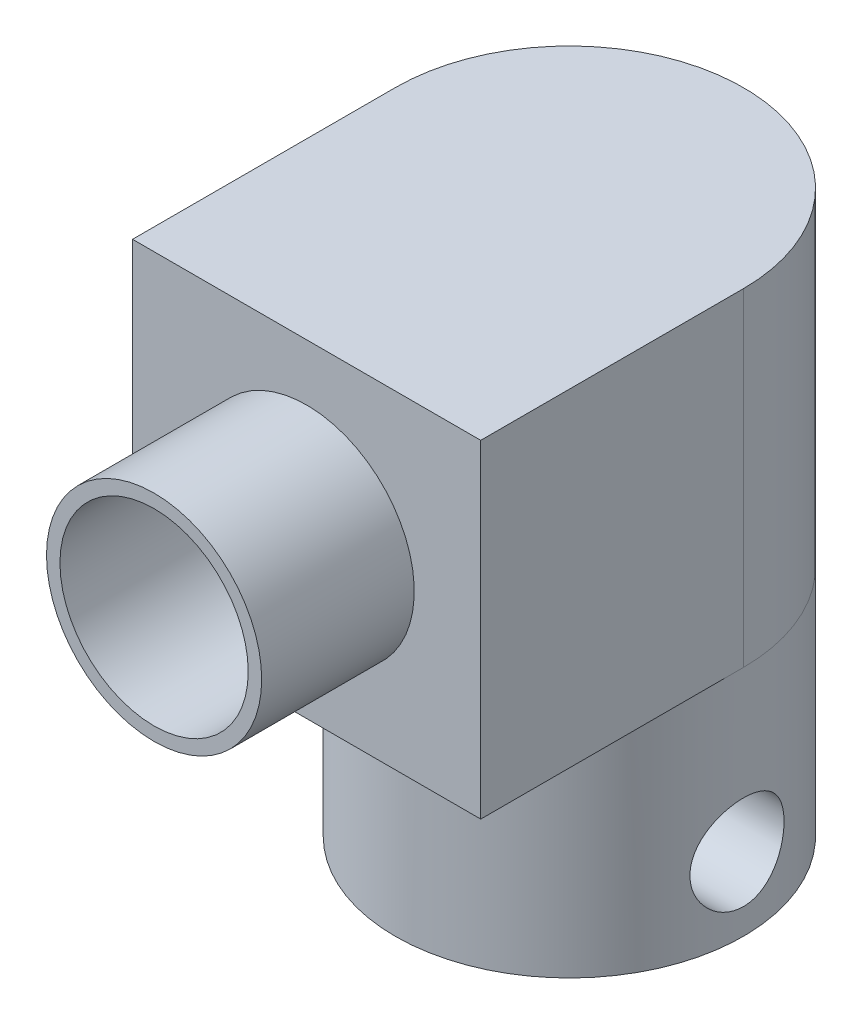
ISO-10303-21;
HEADER;
FILE_DESCRIPTION(('STEP AP214'),'2;1');
FILE_NAME('part.step','',(''),(''),'','','');
FILE_SCHEMA(('AUTOMOTIVE_DESIGN { 1 0 10303 214 1 1 1 1 }'));
ENDSEC;
DATA;
#1=APPLICATION_CONTEXT('core data for automotive mechanical design processes');
#2=APPLICATION_PROTOCOL_DEFINITION('international standard','automotive_design',2000,#1);
#3=PRODUCT_CONTEXT('',#1,'mechanical');
#4=PRODUCT('Part','Part','',(#3));
#5=PRODUCT_RELATED_PRODUCT_CATEGORY('part','',(#4));
#6=PRODUCT_DEFINITION_FORMATION('','',#4);
#7=PRODUCT_DEFINITION_CONTEXT('part definition',#1,'design');
#8=PRODUCT_DEFINITION('design','',#6,#7);
#9=PRODUCT_DEFINITION_SHAPE('','',#8);
#10=(LENGTH_UNIT() NAMED_UNIT(*) SI_UNIT(.MILLI.,.METRE.));
#11=(NAMED_UNIT(*) PLANE_ANGLE_UNIT() SI_UNIT($,.RADIAN.));
#12=(NAMED_UNIT(*) SI_UNIT($,.STERADIAN.) SOLID_ANGLE_UNIT());
#13=UNCERTAINTY_MEASURE_WITH_UNIT(LENGTH_MEASURE(1.E-05),#10,'distance_accuracy_value','');
#14=(GEOMETRIC_REPRESENTATION_CONTEXT(3) GLOBAL_UNCERTAINTY_ASSIGNED_CONTEXT((#13)) GLOBAL_UNIT_ASSIGNED_CONTEXT((#10,
#11,#12)) REPRESENTATION_CONTEXT('',''));
#15=CARTESIAN_POINT('',(0.,0.,0.));
#16=DIRECTION('',(0.,0.,1.));
#17=DIRECTION('',(1.,0.,0.));
#18=AXIS2_PLACEMENT_3D('',#15,#16,#17);
#19=CARTESIAN_POINT('',(0.,27.4955,0.));
#20=DIRECTION('',(0.,-1.,0.));
#21=DIRECTION('',(0.,0.,-1.));
#22=AXIS2_PLACEMENT_3D('',#19,#20,#21);
#23=CYLINDRICAL_SURFACE('',#22,20.55);
#24=CARTESIAN_POINT('',(-20.55,3.04375,0.));
#25=CARTESIAN_POINT('',(-20.5499955456177,3.04375693431693,-0.306142805772744));
#26=CARTESIAN_POINT('',(-20.5430917498544,3.06913690307284,-0.612359281224114));
#27=CARTESIAN_POINT('',(-20.5162220063125,3.16980008715458,-1.21596071790738));
#28=CARTESIAN_POINT('',(-20.4962500289559,3.24510633837057,-1.51334153617645));
#29=CARTESIAN_POINT('',(-20.4454466222146,3.44298702795202,-2.0904724597968));
#30=CARTESIAN_POINT('',(-20.4146294171469,3.56549957165747,-2.37024509569505));
#31=CARTESIAN_POINT('',(-20.3453866191758,3.85408307952741,-2.90527314793898));
#32=CARTESIAN_POINT('',(-20.3069604631205,4.02015726806116,-3.16052674750989));
#33=CARTESIAN_POINT('',(-20.225621469461,4.39531848990894,-3.64534071841445));
#34=CARTESIAN_POINT('',(-20.1826302656136,4.60524929730204,-3.87423501687347));
#35=CARTESIAN_POINT('',(-20.097505842233,5.06036147203112,-4.29403500654341));
#36=CARTESIAN_POINT('',(-20.0553727371284,5.30554750601071,-4.48493566064534));
#37=CARTESIAN_POINT('',(-19.9759305504996,5.82956047415262,-4.82660396235491));
#38=CARTESIAN_POINT('',(-19.9387201915211,6.10890658096501,-4.97660042803178));
#39=CARTESIAN_POINT('',(-19.8744908595214,6.69002190073215,-5.22723344745557));
#40=CARTESIAN_POINT('',(-19.8474699488583,6.99178683740803,-5.32787938687294));
#41=CARTESIAN_POINT('',(-19.8074888143272,7.60178561046114,-5.47463170932488));
#42=CARTESIAN_POINT('',(-19.7942172548341,7.90970747137634,-5.52194795894865));
#43=CARTESIAN_POINT('',(-19.7823077026328,8.52938255380937,-5.5644704110659));
#44=CARTESIAN_POINT('',(-19.7836668924584,8.84113502611086,-5.55968664653769));
#45=CARTESIAN_POINT('',(-19.8005868990115,9.45013793461201,-5.49910428263689));
#46=CARTESIAN_POINT('',(-19.8157386716941,9.74754771142475,-5.44477496267418));
#47=CARTESIAN_POINT('',(-19.8578809510857,10.3288650260883,-5.28899911807753));
#48=CARTESIAN_POINT('',(-19.8848724275681,10.6127714557873,-5.18754873378391));
#49=CARTESIAN_POINT('',(-19.9480089488772,11.1628276619384,-4.939225746161));
#50=CARTESIAN_POINT('',(-19.9842560886036,11.4287345552684,-4.79184219176853));
#51=CARTESIAN_POINT('',(-20.0617655401964,11.9325562645572,-4.45619282649871));
#52=CARTESIAN_POINT('',(-20.1030288634258,12.1704654165182,-4.2679187652381));
#53=CARTESIAN_POINT('',(-20.187619405724,12.6199267130721,-3.84834301404818));
#54=CARTESIAN_POINT('',(-20.2309694061362,12.8303258137321,-3.61580896874028));
#55=CARTESIAN_POINT('',(-20.31360813913,13.2093814534354,-3.11822635050758));
#56=CARTESIAN_POINT('',(-20.3528967026098,13.3780362548226,-2.85317642475709));
#57=CARTESIAN_POINT('',(-20.4232388029467,13.6693433009626,-2.29626761444222));
#58=CARTESIAN_POINT('',(-20.4542539092409,13.7917819247223,-2.00429181671365));
#59=CARTESIAN_POINT('',(-20.5042769768324,13.9855007385593,-1.40286942616056));
#60=CARTESIAN_POINT('',(-20.5232876377727,14.0567924314047,-1.09342677846717));
#61=CARTESIAN_POINT('',(-20.5467495605021,14.1443717498598,-0.475690838742117));
#62=CARTESIAN_POINT('',(-20.5516155058374,14.1622264758924,-0.167635135179871));
#63=CARTESIAN_POINT('',(-20.5474345532138,14.1467596166778,0.44707072594799));
#64=CARTESIAN_POINT('',(-20.5383891367012,14.1134434807091,0.753721029689363));
#65=CARTESIAN_POINT('',(-20.5076700971395,13.9978643188844,1.35128414599486));
#66=CARTESIAN_POINT('',(-20.4862232641405,13.9164797821466,1.64237960607598));
#67=CARTESIAN_POINT('',(-20.4331384948629,13.7080980506069,2.20675448683617));
#68=CARTESIAN_POINT('',(-20.4014994387813,13.5810958436897,2.48003194591187));
#69=CARTESIAN_POINT('',(-20.3305733914616,13.2822068576371,3.00706869299628));
#70=CARTESIAN_POINT('',(-20.2911461290779,13.109473387106,3.26032845894672));
#71=CARTESIAN_POINT('',(-20.2091989702079,12.7250856273105,3.73481606359932));
#72=CARTESIAN_POINT('',(-20.1666784462028,12.5134234273328,3.95603737540058));
#73=CARTESIAN_POINT('',(-20.081804046298,12.0498663041769,4.36680455857517));
#74=CARTESIAN_POINT('',(-20.0394908978611,11.7969812091867,4.55524351584594));
#75=CARTESIAN_POINT('',(-19.961175136926,11.2622797889479,4.88703993718276));
#76=CARTESIAN_POINT('',(-19.9251722674625,10.9804646425215,5.03039923715806));
#77=CARTESIAN_POINT('',(-19.8639697807312,10.3972722442555,5.2668904267061));
#78=CARTESIAN_POINT('',(-19.8387085239865,10.0960183545459,5.36030970931087));
#79=CARTESIAN_POINT('',(-19.801849841402,9.48127503280378,5.49492554517411));
#80=CARTESIAN_POINT('',(-19.7902488038115,9.1677888576346,5.53613590264771));
#81=CARTESIAN_POINT('',(-19.7823317112056,8.54882897432261,5.5643538797296));
#82=CARTESIAN_POINT('',(-19.7855132349689,8.2434417149351,5.55314307569314));
#83=CARTESIAN_POINT('',(-19.805623103107,7.63908616440629,5.48098232967845));
#84=CARTESIAN_POINT('',(-19.8225510747265,7.34011769943553,5.42003373641365));
#85=CARTESIAN_POINT('',(-19.8679431943393,6.7593992433651,5.25117363053405));
#86=CARTESIAN_POINT('',(-19.8963120258814,6.47752860001443,5.14364961325222));
#87=CARTESIAN_POINT('',(-19.9613893851851,5.9356125154418,4.88499128574498));
#88=CARTESIAN_POINT('',(-19.9980992541463,5.67557059339449,4.73384996100479));
#89=CARTESIAN_POINT('',(-20.0771065461908,5.17621429694496,4.38689029147111));
#90=CARTESIAN_POINT('',(-20.119539190167,4.93776260515301,4.18986099449636));
#91=CARTESIAN_POINT('',(-20.2044670418046,4.49672808133383,3.75900819313024));
#92=CARTESIAN_POINT('',(-20.2469622622319,4.29415403841642,3.52517569931734));
#93=CARTESIAN_POINT('',(-20.3283545924845,3.92620159809001,3.0210972604422));
#94=CARTESIAN_POINT('',(-20.3671509996028,3.76174778098293,2.75015874228775));
#95=CARTESIAN_POINT('',(-20.4356628373764,3.48097984957658,2.18343866249));
#96=CARTESIAN_POINT('',(-20.4653839305848,3.36463570107,1.88767273943278));
#97=CARTESIAN_POINT('',(-20.5086824116325,3.19807241802424,1.32762368378215));
#98=CARTESIAN_POINT('',(-20.5240620531397,3.14033817559968,1.06569067632233));
#99=CARTESIAN_POINT('',(-20.5447222673251,3.06317593988418,0.535856839401154));
#100=CARTESIAN_POINT('',(-20.550003898773,3.0437439306225,0.267956638576209));
#101=CARTESIAN_POINT('',(-20.55,3.04375,0.));
#102=B_SPLINE_CURVE_WITH_KNOTS('',3,(#24,#25,#26,#27,#28,#29,#30,#31,#32,#33,#34,#35,#36,#37,
#38,#39,#40,#41,#42,#43,#44,#45,#46,#47,#48,#49,#50,#51,#52,#53,#54,#55,#56,#57,#58,#59,#60,#61,
#62,#63,#64,#65,#66,#67,#68,#69,#70,#71,#72,#73,#74,#75,#76,#77,#78,#79,#80,#81,#82,#83,#84,#85,
#86,#87,#88,#89,#90,#91,#92,#93,#94,#95,#96,#97,#98,#99,#100,#101),.UNSPECIFIED.,.T.,.F.,(4,2,2,
2,2,2,2,2,2,2,2,2,2,2,2,2,2,2,2,2,2,2,2,2,2,2,2,2,2,2,2,2,2,2,2,2,2,2,4),(0.,0.917445584889056,
1.83531477227169,2.75198456573384,3.6687222289101,4.60506159920432,5.54152502462187,
6.49458423038777,7.44746210936509,8.37825766721183,9.3088739835236,10.2127595967962,
11.1167192598869,12.0311166809247,12.945698769504,13.8909861592124,14.8363128910214,
15.7859571209259,16.7353877121186,17.6566881796655,18.5778905430458,19.4827565385181,
20.387721984066,21.3107822105116,22.2340302198415,23.1840996897835,24.134130462286,
25.0786335146744,26.0228867851292,26.9352866548291,27.8476617842842,28.7525877546645,
29.6576593359882,30.5900527016247,31.5226741648892,32.4759796393901,33.4286890765618,
34.2317829601677,35.0347926352863),.UNSPECIFIED.);
#103=CARTESIAN_POINT('',(-20.55,3.04375,0.));
#104=VERTEX_POINT('',#103);
#105=EDGE_CURVE('E147',#104,#104,#102,.T.);
#106=ORIENTED_EDGE('',*,*,#105,.T.);
#107=EDGE_LOOP('',(#106));
#108=FACE_BOUND('',#107,.T.);
#109=CARTESIAN_POINT('',(19.7846047708187,8.6,-5.55625));
#110=CARTESIAN_POINT('',(19.7846099111517,8.29408791419413,-5.55624295354956));
#111=CARTESIAN_POINT('',(19.7917774234277,7.98810194953752,-5.53089989961452));
#112=CARTESIAN_POINT('',(19.8195843145754,7.38497846933255,-5.43039661013299));
#113=CARTESIAN_POINT('',(19.8402302061305,7.08784530402357,-5.3552122912726));
#114=CARTESIAN_POINT('',(19.8924884369557,6.51123996073559,-5.15768785493998));
#115=CARTESIAN_POINT('',(19.9240850558071,6.23174314097737,-5.0354153075904));
#116=CARTESIAN_POINT('',(19.9946644283277,5.69718328391201,-4.74739817436022));
#117=CARTESIAN_POINT('',(20.0336478143843,5.44212234139769,-4.58164986601607));
#118=CARTESIAN_POINT('',(20.1157315238416,4.95711655139443,-4.20682860424944));
#119=CARTESIAN_POINT('',(20.1589064605905,4.72789300831878,-3.99683845225135));
#120=CARTESIAN_POINT('',(20.2438652612443,4.30745028959308,-3.54146621058755));
#121=CARTESIAN_POINT('',(20.2856489771128,4.11623514763083,-3.29608036927498));
#122=CARTESIAN_POINT('',(20.3639516325386,3.77421620221989,-2.77186700883269));
#123=CARTESIAN_POINT('',(20.4003723001507,3.62413143770808,-2.49255440334088));
#124=CARTESIAN_POINT('',(20.4629879883136,3.373326219249,-1.9115103105989));
#125=CARTESIAN_POINT('',(20.4891847831941,3.27259719894902,-1.60978272424654));
#126=CARTESIAN_POINT('',(20.5278734346323,3.12570281135179,-1.00000449152069));
#127=CARTESIAN_POINT('',(20.5406730979897,3.0783099951828,-0.692269408006934));
#128=CARTESIAN_POINT('',(20.5522023409067,3.03556948971917,-0.0729679321546421));
#129=CARTESIAN_POINT('',(20.5509343388363,3.04021285489445,0.238597792460219));
#130=CARTESIAN_POINT('',(20.5346958110324,3.10055280238229,0.848165693500861));
#131=CARTESIAN_POINT('',(20.5200813179014,3.15492292363009,1.14631011066351));
#132=CARTESIAN_POINT('',(20.4792133458587,3.31102755340359,1.72907457504629));
#133=CARTESIAN_POINT('',(20.4529591940996,3.41276480007183,2.01369383937207));
#134=CARTESIAN_POINT('',(20.3912375825066,3.6617195659057,2.56469004876672));
#135=CARTESIAN_POINT('',(20.3556794464865,3.80938755780164,2.83085288316265));
#136=CARTESIAN_POINT('',(20.2791749499582,4.14566527990044,3.33507026200387));
#137=CARTESIAN_POINT('',(20.2382275144784,4.33428318302812,3.57311918071209));
#138=CARTESIAN_POINT('',(20.153852480509,4.75413140943505,4.02226945508818));
#139=CARTESIAN_POINT('',(20.1103873906528,4.9865179856255,4.23228423208074));
#140=CARTESIAN_POINT('',(20.0270371570568,5.48365991115382,4.6106310513191));
#141=CARTESIAN_POINT('',(19.9871522445296,5.7484173484398,4.77896040269859));
#142=CARTESIAN_POINT('',(19.9153245638176,6.3051942959987,5.07001654278555));
#143=CARTESIAN_POINT('',(19.883435047145,6.59737966166185,5.19244012807638));
#144=CARTESIAN_POINT('',(19.8318664794739,7.19926439334426,5.38606754506408));
#145=CARTESIAN_POINT('',(19.8121843026605,7.50895925369671,5.45728448949225));
#146=CARTESIAN_POINT('',(19.787927019825,8.12689057895396,5.54458736251051));
#147=CARTESIAN_POINT('',(19.7829070201881,8.4348803656252,5.56229743863344));
#148=CARTESIAN_POINT('',(19.7873238569898,9.04942216435015,5.54656516408198));
#149=CARTESIAN_POINT('',(19.7967591056933,9.35597433059962,5.5131284312701));
#150=CARTESIAN_POINT('',(19.8285928261844,9.9526277673974,5.39748517125687));
#151=CARTESIAN_POINT('',(19.8507296470314,10.2429349959468,5.31626220272824));
#152=CARTESIAN_POINT('',(19.9052149869172,10.8058037456702,5.10846159971124));
#153=CARTESIAN_POINT('',(19.9375648668522,11.0783628960603,4.98187792057755));
#154=CARTESIAN_POINT('',(20.0097390709008,11.6047736218821,4.68367513184515));
#155=CARTESIAN_POINT('',(20.0497152752714,11.8580658697406,4.5111062695207));
#156=CARTESIAN_POINT('',(20.1322838903647,12.3326932611006,4.12700365323291));
#157=CARTESIAN_POINT('',(20.1748768061121,12.5540222079014,3.91546236175647));
#158=CARTESIAN_POINT('',(20.2594168099149,12.9652203176716,3.45189410124383));
#159=CARTESIAN_POINT('',(20.3013067843807,13.1539548172731,3.19884813357714));
#160=CARTESIAN_POINT('',(20.3784205589915,13.4862715017229,2.66372666754108));
#161=CARTESIAN_POINT('',(20.4136447139998,13.629856090453,2.38165271574795));
#162=CARTESIAN_POINT('',(20.4732309169378,13.8664663082298,1.79846779879701));
#163=CARTESIAN_POINT('',(20.4976742124607,13.9598713123838,1.497519458451));
#164=CARTESIAN_POINT('',(20.5333024918853,14.0945612163352,0.883436390131982));
#165=CARTESIAN_POINT('',(20.5444905026413,14.1358580152214,0.570304461165306));
#166=CARTESIAN_POINT('',(20.5522002636445,14.1643964846355,-0.0486695197422701));
#167=CARTESIAN_POINT('',(20.5491730265587,14.1533003821365,-0.354430384698936));
#168=CARTESIAN_POINT('',(20.5298169461267,14.0812396365465,-0.95956460260317));
#169=CARTESIAN_POINT('',(20.5134886273872,14.0202769602378,-1.2589382069922));
#170=CARTESIAN_POINT('',(20.46945895039,13.8511638806168,-1.84074098156406));
#171=CARTESIAN_POINT('',(20.4418409766328,13.7433590895854,-2.12327734090201));
#172=CARTESIAN_POINT('',(20.3781157916977,13.4839300149016,-2.6664125733757));
#173=CARTESIAN_POINT('',(20.3420073647127,13.3322994548188,-2.9270082974143));
#174=CARTESIAN_POINT('',(20.2639293925301,12.9847051723792,-3.42656942574024));
#175=CARTESIAN_POINT('',(20.2218268893977,12.7876454548188,-3.66475138677513));
#176=CARTESIAN_POINT('',(20.137031070218,12.3568540265207,-4.105228294939));
#177=CARTESIAN_POINT('',(20.0943376002296,12.1231125901681,-4.30751369423161));
#178=CARTESIAN_POINT('',(20.0120708053271,11.6191865815018,-4.67502641042557));
#179=CARTESIAN_POINT('',(19.9725907391434,11.3482929922853,-4.83930432617433));
#180=CARTESIAN_POINT('',(19.902553710437,10.7816970138126,-5.11975461205687));
#181=CARTESIAN_POINT('',(19.8719910712672,10.4860105622046,-5.23595760545752));
#182=CARTESIAN_POINT('',(19.8273669587936,9.92629804030538,-5.40223793610318));
#183=CARTESIAN_POINT('',(19.8114630639176,9.66463496457813,-5.45985451533049));
#184=CARTESIAN_POINT('',(19.7900803543849,9.13533296325045,-5.53686130732699));
#185=CARTESIAN_POINT('',(19.7846002726627,8.86769476795701,-5.55625616614382));
#186=CARTESIAN_POINT('',(19.7846047708187,8.6,-5.55625));
#187=B_SPLINE_CURVE_WITH_KNOTS('',3,(#109,#110,#111,#112,#113,#114,#115,#116,#117,#118,#119,
#120,#121,#122,#123,#124,#125,#126,#127,#128,#129,#130,#131,#132,#133,#134,#135,#136,#137,#138,
#139,#140,#141,#142,#143,#144,#145,#146,#147,#148,#149,#150,#151,#152,#153,#154,#155,#156,#157,
#158,#159,#160,#161,#162,#163,#164,#165,#166,#167,#168,#169,#170,#171,#172,#173,#174,#175,#176,
#177,#178,#179,#180,#181,#182,#183,#184,#185,#186),.UNSPECIFIED.,.T.,.F.,(4,2,2,2,2,2,2,2,2,2,2,
2,2,2,2,2,2,2,2,2,2,2,2,2,2,2,2,2,2,2,2,2,2,2,2,2,2,2,4),(0.,0.916751587120096,1.83394647207474,
2.74983008614831,3.6657921452413,4.60303741061557,5.54038208923997,6.49319683765418,
7.44584615363307,8.37609233002781,9.30617859043214,10.2121562525253,11.1181862928032,
12.0333985393267,12.9487936152688,13.8930569412016,14.8373812050854,15.7878371516066,
16.7380496235284,17.6591140357364,18.5800772873481,19.4827170745915,20.3854771899225,
21.3085617665974,22.2318250614194,23.1826142737027,24.1333528552758,25.0767985875286,
26.0200288416782,26.9335387785712,27.84701268755,28.7538582687614,29.6608337866748,
30.5925372550853,31.5244881695358,32.477673888078,33.430251498071,34.2325716777875,
35.0347943253231),.UNSPECIFIED.);
#188=CARTESIAN_POINT('',(19.7846047708187,8.6,-5.55625));
#189=VERTEX_POINT('',#188);
#190=EDGE_CURVE('E136',#189,#189,#187,.T.);
#191=ORIENTED_EDGE('',*,*,#190,.T.);
#192=EDGE_LOOP('',(#191));
#193=FACE_BOUND('',#192,.T.);
#194=CARTESIAN_POINT('',(0.,0.,0.));
#195=DIRECTION('',(0.,1.,0.));
#196=DIRECTION('',(0.,0.,1.));
#197=AXIS2_PLACEMENT_3D('',#194,#195,#196);
#198=CIRCLE('',#197,20.55);
#199=CARTESIAN_POINT('',(0.,0.,20.55));
#200=VERTEX_POINT('',#199);
#201=EDGE_CURVE('E132',#200,#200,#198,.T.);
#202=ORIENTED_EDGE('',*,*,#201,.T.);
#203=EDGE_LOOP('',(#202));
#204=FACE_BOUND('',#203,.T.);
#205=CARTESIAN_POINT('',(0.,27.4955,0.));
#206=DIRECTION('',(0.,1.,0.));
#207=DIRECTION('',(0.,0.,1.));
#208=AXIS2_PLACEMENT_3D('',#205,#206,#207);
#209=CIRCLE('',#208,20.55);
#210=CARTESIAN_POINT('',(-20.55,27.4955,0.));
#211=VERTEX_POINT('',#210);
#212=CARTESIAN_POINT('',(20.55,27.4955,0.));
#213=VERTEX_POINT('',#212);
#214=EDGE_CURVE('E133',#211,#213,#209,.T.);
#215=ORIENTED_EDGE('',*,*,#214,.F.);
#216=CARTESIAN_POINT('',(0.,27.4955,0.));
#217=DIRECTION('',(0.,-1.,0.));
#218=DIRECTION('',(0.,0.,-1.));
#219=AXIS2_PLACEMENT_3D('',#216,#217,#218);
#220=CIRCLE('',#219,20.55);
#221=EDGE_CURVE('E12',#211,#213,#220,.T.);
#222=ORIENTED_EDGE('',*,*,#221,.T.);
#223=EDGE_LOOP('',(#215,#222));
#224=FACE_BOUND('',#223,.T.);
#225=ADVANCED_FACE('F42',(#108,#193,#204,#224),#23,.T.);
#226=ORIENTED_EDGE('',*,*,#221,.F.);
#227=DIRECTION('',(0.,-1.,0.));
#228=VECTOR('',#227,1.);
#229=CARTESIAN_POINT('',(-20.55,66.2178,0.));
#230=LINE('',#229,#228);
#231=CARTESIAN_POINT('',(-20.55,66.2178,0.));
#232=VERTEX_POINT('',#231);
#233=EDGE_CURVE('E104',#232,#211,#230,.T.);
#234=ORIENTED_EDGE('',*,*,#233,.F.);
#235=CARTESIAN_POINT('',(0.,66.2178,0.));
#236=DIRECTION('',(0.,1.,0.));
#237=DIRECTION('',(0.,0.,1.));
#238=AXIS2_PLACEMENT_3D('',#235,#236,#237);
#239=CIRCLE('',#238,20.55);
#240=CARTESIAN_POINT('',(20.55,66.2178,0.));
#241=VERTEX_POINT('',#240);
#242=EDGE_CURVE('E93',#241,#232,#239,.T.);
#243=ORIENTED_EDGE('',*,*,#242,.F.);
#244=DIRECTION('',(0.,-1.,0.));
#245=VECTOR('',#244,1.);
#246=CARTESIAN_POINT('',(20.55,66.2178,0.));
#247=LINE('',#246,#245);
#248=EDGE_CURVE('E112',#241,#213,#247,.T.);
#249=ORIENTED_EDGE('',*,*,#248,.T.);
#250=EDGE_LOOP('',(#226,#234,#243,#249));
#251=FACE_BOUND('',#250,.T.);
#252=ADVANCED_FACE('F44',(#251),#23,.T.);
#253=CARTESIAN_POINT('',(0.,0.,0.));
#254=DIRECTION('',(0.,1.,0.));
#255=DIRECTION('',(0.,0.,1.));
#256=AXIS2_PLACEMENT_3D('',#253,#254,#255);
#257=PLANE('',#256);
#258=CARTESIAN_POINT('',(11.2,0.,11.2));
#259=DIRECTION('',(0.,-1.,0.));
#260=DIRECTION('',(0.,0.,-1.));
#261=AXIS2_PLACEMENT_3D('',#258,#259,#260);
#262=CIRCLE('',#261,2.);
#263=CARTESIAN_POINT('',(11.2,0.,9.20000000000005));
#264=VERTEX_POINT('',#263);
#265=EDGE_CURVE('E222',#264,#264,#262,.T.);
#266=ORIENTED_EDGE('',*,*,#265,.F.);
#267=EDGE_LOOP('',(#266));
#268=FACE_BOUND('',#267,.T.);
#269=CARTESIAN_POINT('',(-11.2000000000001,0.,-11.2));
#270=DIRECTION('',(0.,-1.,0.));
#271=DIRECTION('',(0.,0.,-1.));
#272=AXIS2_PLACEMENT_3D('',#269,#270,#271);
#273=CIRCLE('',#272,2.);
#274=CARTESIAN_POINT('',(-11.2000000000001,0.,-13.2));
#275=VERTEX_POINT('',#274);
#276=EDGE_CURVE('E213',#275,#275,#273,.T.);
#277=ORIENTED_EDGE('',*,*,#276,.F.);
#278=EDGE_LOOP('',(#277));
#279=FACE_BOUND('',#278,.T.);
#280=ORIENTED_EDGE('',*,*,#201,.F.);
#281=EDGE_LOOP('',(#280));
#282=FACE_BOUND('',#281,.T.);
#283=ADVANCED_FACE('F183',(#268,#279,#282),#257,.F.);
#284=CARTESIAN_POINT('',(0.,27.4955,0.));
#285=DIRECTION('',(0.,1.,0.));
#286=DIRECTION('',(0.,0.,1.));
#287=AXIS2_PLACEMENT_3D('',#284,#285,#286);
#288=PLANE('',#287);
#289=DIRECTION('',(0.,0.,1.));
#290=VECTOR('',#289,1.);
#291=CARTESIAN_POINT('',(-20.55,27.4955,0.));
#292=LINE('',#291,#290);
#293=CARTESIAN_POINT('',(-20.55,27.4955,31.012));
#294=VERTEX_POINT('',#293);
#295=EDGE_CURVE('E100',#211,#294,#292,.T.);
#296=ORIENTED_EDGE('',*,*,#295,.F.);
#297=ORIENTED_EDGE('',*,*,#214,.T.);
#298=DIRECTION('',(0.,0.,-1.));
#299=VECTOR('',#298,1.);
#300=CARTESIAN_POINT('',(20.55,27.4955,31.012));
#301=LINE('',#300,#299);
#302=CARTESIAN_POINT('',(20.55,27.4955,31.012));
#303=VERTEX_POINT('',#302);
#304=EDGE_CURVE('E122',#303,#213,#301,.T.);
#305=ORIENTED_EDGE('',*,*,#304,.F.);
#306=DIRECTION('',(1.,0.,0.));
#307=VECTOR('',#306,1.);
#308=CARTESIAN_POINT('',(-20.55,27.4955,31.012));
#309=LINE('',#308,#307);
#310=EDGE_CURVE('E118',#294,#303,#309,.T.);
#311=ORIENTED_EDGE('',*,*,#310,.F.);
#312=EDGE_LOOP('',(#296,#297,#305,#311));
#313=FACE_BOUND('',#312,.T.);
#314=ADVANCED_FACE('F180',(#313),#288,.F.);
#315=CARTESIAN_POINT('',(-20.55,66.2178,0.));
#316=DIRECTION('',(1.,0.,0.));
#317=DIRECTION('',(0.,0.,-1.));
#318=AXIS2_PLACEMENT_3D('',#315,#316,#317);
#319=PLANE('',#318);
#320=ORIENTED_EDGE('',*,*,#295,.T.);
#321=DIRECTION('',(0.,-1.,0.));
#322=VECTOR('',#321,1.);
#323=CARTESIAN_POINT('',(-20.55,66.2178,31.012));
#324=LINE('',#323,#322);
#325=CARTESIAN_POINT('',(-20.55,66.2178,31.012));
#326=VERTEX_POINT('',#325);
#327=EDGE_CURVE('E97',#326,#294,#324,.T.);
#328=ORIENTED_EDGE('',*,*,#327,.F.);
#329=DIRECTION('',(0.,0.,1.));
#330=VECTOR('',#329,1.);
#331=CARTESIAN_POINT('',(-20.55,66.2178,0.));
#332=LINE('',#331,#330);
#333=EDGE_CURVE('E87',#232,#326,#332,.T.);
#334=ORIENTED_EDGE('',*,*,#333,.F.);
#335=ORIENTED_EDGE('',*,*,#233,.T.);
#336=EDGE_LOOP('',(#320,#328,#334,#335));
#337=FACE_BOUND('',#336,.T.);
#338=ADVANCED_FACE('F98',(#337),#319,.F.);
#339=CARTESIAN_POINT('',(-20.55,66.2178,31.012));
#340=DIRECTION('',(0.,0.,-1.));
#341=DIRECTION('',(-1.,0.,0.));
#342=AXIS2_PLACEMENT_3D('',#339,#340,#341);
#343=PLANE('',#342);
#344=CARTESIAN_POINT('',(0.,46.85665,31.012));
#345=DIRECTION('',(0.,0.,-1.));
#346=DIRECTION('',(-1.,0.,0.));
#347=AXIS2_PLACEMENT_3D('',#344,#345,#346);
#348=CIRCLE('',#347,12.7);
#349=CARTESIAN_POINT('',(-12.7,46.85665,31.012));
#350=VERTEX_POINT('',#349);
#351=EDGE_CURVE('E52',#350,#350,#348,.F.);
#352=ORIENTED_EDGE('',*,*,#351,.F.);
#353=EDGE_LOOP('',(#352));
#354=FACE_BOUND('',#353,.T.);
#355=ORIENTED_EDGE('',*,*,#310,.T.);
#356=DIRECTION('',(0.,-1.,0.));
#357=VECTOR('',#356,1.);
#358=CARTESIAN_POINT('',(20.55,66.2178,31.012));
#359=LINE('',#358,#357);
#360=CARTESIAN_POINT('',(20.55,66.2178,31.012));
#361=VERTEX_POINT('',#360);
#362=EDGE_CURVE('E105',#361,#303,#359,.T.);
#363=ORIENTED_EDGE('',*,*,#362,.F.);
#364=DIRECTION('',(1.,0.,0.));
#365=VECTOR('',#364,1.);
#366=CARTESIAN_POINT('',(-20.55,66.2178,31.012));
#367=LINE('',#366,#365);
#368=EDGE_CURVE('E90',#326,#361,#367,.T.);
#369=ORIENTED_EDGE('',*,*,#368,.F.);
#370=ORIENTED_EDGE('',*,*,#327,.T.);
#371=EDGE_LOOP('',(#355,#363,#369,#370));
#372=FACE_BOUND('',#371,.T.);
#373=ADVANCED_FACE('F107',(#354,#372),#343,.F.);
#374=CARTESIAN_POINT('',(20.55,66.2178,31.012));
#375=DIRECTION('',(-1.,0.,0.));
#376=DIRECTION('',(0.,0.,1.));
#377=AXIS2_PLACEMENT_3D('',#374,#375,#376);
#378=PLANE('',#377);
#379=ORIENTED_EDGE('',*,*,#304,.T.);
#380=ORIENTED_EDGE('',*,*,#248,.F.);
#381=DIRECTION('',(0.,0.,-1.));
#382=VECTOR('',#381,1.);
#383=CARTESIAN_POINT('',(20.55,66.2178,31.012));
#384=LINE('',#383,#382);
#385=EDGE_CURVE('E66',#361,#241,#384,.T.);
#386=ORIENTED_EDGE('',*,*,#385,.F.);
#387=ORIENTED_EDGE('',*,*,#362,.T.);
#388=EDGE_LOOP('',(#379,#380,#386,#387));
#389=FACE_BOUND('',#388,.T.);
#390=ADVANCED_FACE('F179',(#389),#378,.F.);
#391=CARTESIAN_POINT('',(0.,66.2178,0.));
#392=DIRECTION('',(0.,1.,0.));
#393=DIRECTION('',(0.,0.,1.));
#394=AXIS2_PLACEMENT_3D('',#391,#392,#393);
#395=PLANE('',#394);
#396=ORIENTED_EDGE('',*,*,#242,.T.);
#397=ORIENTED_EDGE('',*,*,#333,.T.);
#398=ORIENTED_EDGE('',*,*,#368,.T.);
#399=ORIENTED_EDGE('',*,*,#385,.T.);
#400=EDGE_LOOP('',(#396,#397,#398,#399));
#401=FACE_BOUND('',#400,.T.);
#402=ADVANCED_FACE('F88',(#401),#395,.T.);
#403=CARTESIAN_POINT('',(-11.2000000000001,6.35,-11.2));
#404=DIRECTION('',(0.,-1.,0.));
#405=DIRECTION('',(0.,0.,-1.));
#406=AXIS2_PLACEMENT_3D('',#403,#404,#405);
#407=CYLINDRICAL_SURFACE('',#406,2.);
#408=CARTESIAN_POINT('',(-11.2000000000001,6.35,-11.2));
#409=DIRECTION('',(0.,-1.,0.));
#410=DIRECTION('',(0.,0.,-1.));
#411=AXIS2_PLACEMENT_3D('',#408,#409,#410);
#412=CIRCLE('',#411,2.);
#413=CARTESIAN_POINT('',(-11.2000000000001,6.35,-13.2));
#414=VERTEX_POINT('',#413);
#415=EDGE_CURVE('E217',#414,#414,#412,.T.);
#416=ORIENTED_EDGE('',*,*,#415,.F.);
#417=EDGE_LOOP('',(#416));
#418=FACE_BOUND('',#417,.T.);
#419=ORIENTED_EDGE('',*,*,#276,.T.);
#420=EDGE_LOOP('',(#419));
#421=FACE_BOUND('',#420,.T.);
#422=ADVANCED_FACE('F172',(#418,#421),#407,.F.);
#423=CARTESIAN_POINT('',(-11.2000000000001,6.35,-11.2));
#424=DIRECTION('',(0.,-1.,0.));
#425=DIRECTION('',(0.,0.,-1.));
#426=AXIS2_PLACEMENT_3D('',#423,#424,#425);
#427=PLANE('',#426);
#428=ORIENTED_EDGE('',*,*,#415,.T.);
#429=EDGE_LOOP('',(#428));
#430=FACE_BOUND('',#429,.T.);
#431=ADVANCED_FACE('F168',(#430),#427,.T.);
#432=CARTESIAN_POINT('',(11.2,6.35,11.2));
#433=DIRECTION('',(0.,-1.,0.));
#434=DIRECTION('',(0.,0.,-1.));
#435=AXIS2_PLACEMENT_3D('',#432,#433,#434);
#436=CYLINDRICAL_SURFACE('',#435,2.);
#437=CARTESIAN_POINT('',(11.2,6.35,11.2));
#438=DIRECTION('',(0.,-1.,0.));
#439=DIRECTION('',(0.,0.,-1.));
#440=AXIS2_PLACEMENT_3D('',#437,#438,#439);
#441=CIRCLE('',#440,2.);
#442=CARTESIAN_POINT('',(11.2,6.35,9.20000000000005));
#443=VERTEX_POINT('',#442);
#444=EDGE_CURVE('E119',#443,#443,#441,.T.);
#445=ORIENTED_EDGE('',*,*,#444,.F.);
#446=EDGE_LOOP('',(#445));
#447=FACE_BOUND('',#446,.T.);
#448=ORIENTED_EDGE('',*,*,#265,.T.);
#449=EDGE_LOOP('',(#448));
#450=FACE_BOUND('',#449,.T.);
#451=ADVANCED_FACE('F164',(#447,#450),#436,.F.);
#452=CARTESIAN_POINT('',(11.2,6.35,11.2));
#453=DIRECTION('',(0.,-1.,0.));
#454=DIRECTION('',(0.,0.,-1.));
#455=AXIS2_PLACEMENT_3D('',#452,#453,#454);
#456=PLANE('',#455);
#457=ORIENTED_EDGE('',*,*,#444,.T.);
#458=EDGE_LOOP('',(#457));
#459=FACE_BOUND('',#458,.T.);
#460=ADVANCED_FACE('F157',(#459),#456,.T.);
#461=CARTESIAN_POINT('',(-20.55,8.6,0.));
#462=DIRECTION('',(1.,0.,0.));
#463=DIRECTION('',(0.,0.,-1.));
#464=AXIS2_PLACEMENT_3D('',#461,#462,#463);
#465=CYLINDRICAL_SURFACE('',#464,5.55625);
#466=ORIENTED_EDGE('',*,*,#190,.F.);
#467=EDGE_LOOP('',(#466));
#468=FACE_BOUND('',#467,.T.);
#469=ORIENTED_EDGE('',*,*,#105,.F.);
#470=EDGE_LOOP('',(#469));
#471=FACE_BOUND('',#470,.T.);
#472=ADVANCED_FACE('F151',(#468,#471),#465,.F.);
#473=CARTESIAN_POINT('',(0.,46.85665,49.0206));
#474=DIRECTION('',(0.,0.,1.));
#475=DIRECTION('',(1.,0.,0.));
#476=AXIS2_PLACEMENT_3D('',#473,#474,#475);
#477=PLANE('',#476);
#478=CARTESIAN_POINT('',(0.,46.85665,49.0206));
#479=DIRECTION('',(0.,0.,1.));
#480=DIRECTION('',(1.,0.,0.));
#481=AXIS2_PLACEMENT_3D('',#478,#479,#480);
#482=CIRCLE('',#481,12.7);
#483=CARTESIAN_POINT('',(12.7,46.85665,49.0206));
#484=VERTEX_POINT('',#483);
#485=EDGE_CURVE('E218',#484,#484,#482,.T.);
#486=ORIENTED_EDGE('',*,*,#485,.T.);
#487=EDGE_LOOP('',(#486));
#488=FACE_BOUND('',#487,.T.);
#489=CARTESIAN_POINT('',(0.,46.85665,49.0206));
#490=DIRECTION('',(0.,0.,1.));
#491=DIRECTION('',(1.,0.,0.));
#492=AXIS2_PLACEMENT_3D('',#489,#490,#491);
#493=CIRCLE('',#492,11.1125);
#494=CARTESIAN_POINT('',(11.1125,46.85665,49.0206));
#495=VERTEX_POINT('',#494);
#496=EDGE_CURVE('E232',#495,#495,#493,.T.);
#497=ORIENTED_EDGE('',*,*,#496,.F.);
#498=EDGE_LOOP('',(#497));
#499=FACE_BOUND('',#498,.T.);
#500=ADVANCED_FACE('F156',(#488,#499),#477,.T.);
#501=CARTESIAN_POINT('',(0.,46.85665,49.0206));
#502=DIRECTION('',(0.,0.,-1.));
#503=DIRECTION('',(-1.,0.,0.));
#504=AXIS2_PLACEMENT_3D('',#501,#502,#503);
#505=CYLINDRICAL_SURFACE('',#504,12.7);
#506=ORIENTED_EDGE('',*,*,#485,.F.);
#507=EDGE_LOOP('',(#506));
#508=FACE_BOUND('',#507,.T.);
#509=ORIENTED_EDGE('',*,*,#351,.T.);
#510=EDGE_LOOP('',(#509));
#511=FACE_BOUND('',#510,.T.);
#512=ADVANCED_FACE('F159',(#508,#511),#505,.T.);
#513=CARTESIAN_POINT('',(0.,46.85665,49.0206));
#514=DIRECTION('',(0.,0.,-1.));
#515=DIRECTION('',(-1.,0.,0.));
#516=AXIS2_PLACEMENT_3D('',#513,#514,#515);
#517=CYLINDRICAL_SURFACE('',#516,11.1125);
#518=ORIENTED_EDGE('',*,*,#496,.T.);
#519=EDGE_LOOP('',(#518));
#520=FACE_BOUND('',#519,.T.);
#521=CARTESIAN_POINT('',(0.,46.85665,31.012));
#522=DIRECTION('',(0.,0.,1.));
#523=DIRECTION('',(1.,0.,0.));
#524=AXIS2_PLACEMENT_3D('',#521,#522,#523);
#525=CIRCLE('',#524,11.1125);
#526=CARTESIAN_POINT('',(11.1125,46.85665,31.012));
#527=VERTEX_POINT('',#526);
#528=EDGE_CURVE('E233',#527,#527,#525,.T.);
#529=ORIENTED_EDGE('',*,*,#528,.F.);
#530=EDGE_LOOP('',(#529));
#531=FACE_BOUND('',#530,.T.);
#532=ADVANCED_FACE('F241',(#520,#531),#517,.F.);
#533=ORIENTED_EDGE('',*,*,#528,.T.);
#534=EDGE_LOOP('',(#533));
#535=FACE_BOUND('',#534,.T.);
#536=ADVANCED_FACE('F191',(#535),#343,.F.);
#537=CLOSED_SHELL('',(#225,#252,#283,#314,#338,#373,#390,#402,#422,#431,#451,#460,#472,#500,
#512,#532,#536));
#538=MANIFOLD_SOLID_BREP('B2',#537);
#539=ADVANCED_BREP_SHAPE_REPRESENTATION('',(#18,#538),#14);
#540=SHAPE_DEFINITION_REPRESENTATION(#9,#539);
ENDSEC;
END-ISO-10303-21;
